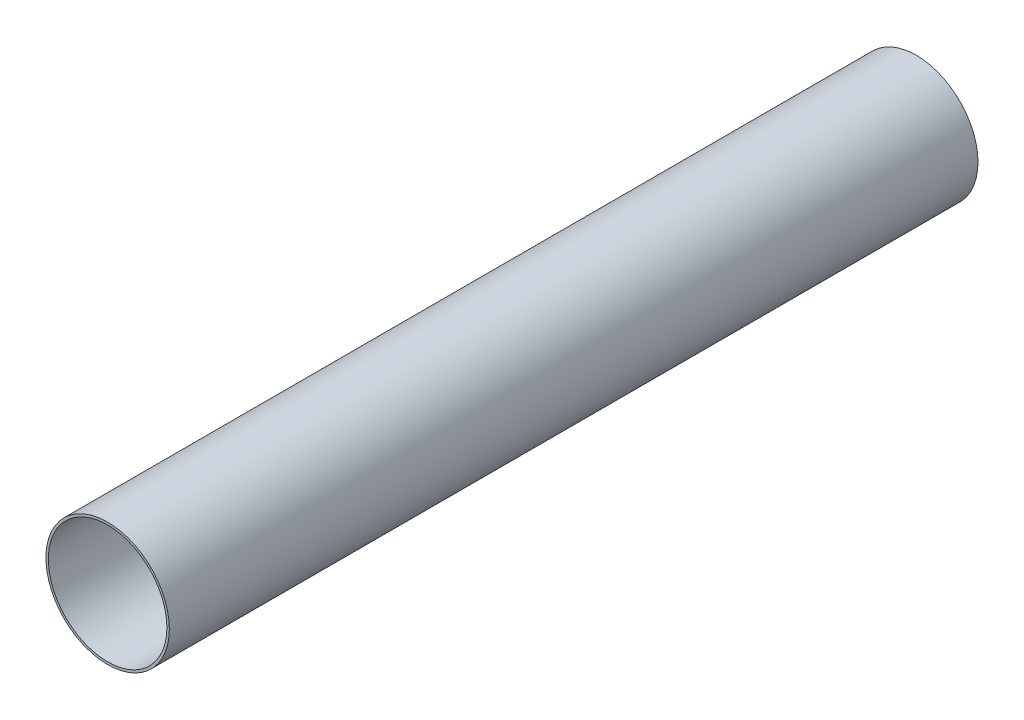
ISO-10303-21;
HEADER;
FILE_DESCRIPTION(('STEP AP214'),'2;1');
FILE_NAME('part.step','',(''),(''),'','','');
FILE_SCHEMA(('AUTOMOTIVE_DESIGN { 1 0 10303 214 1 1 1 1 }'));
ENDSEC;
DATA;
#1=APPLICATION_CONTEXT('core data for automotive mechanical design processes');
#2=APPLICATION_PROTOCOL_DEFINITION('international standard','automotive_design',2000,#1);
#3=PRODUCT_CONTEXT('',#1,'mechanical');
#4=PRODUCT('Part','Part','',(#3));
#5=PRODUCT_RELATED_PRODUCT_CATEGORY('part','',(#4));
#6=PRODUCT_DEFINITION_FORMATION('','',#4);
#7=PRODUCT_DEFINITION_CONTEXT('part definition',#1,'design');
#8=PRODUCT_DEFINITION('design','',#6,#7);
#9=PRODUCT_DEFINITION_SHAPE('','',#8);
#10=(LENGTH_UNIT() NAMED_UNIT(*) SI_UNIT(.MILLI.,.METRE.));
#11=(NAMED_UNIT(*) PLANE_ANGLE_UNIT() SI_UNIT($,.RADIAN.));
#12=(NAMED_UNIT(*) SI_UNIT($,.STERADIAN.) SOLID_ANGLE_UNIT());
#13=UNCERTAINTY_MEASURE_WITH_UNIT(LENGTH_MEASURE(1.E-05),#10,'distance_accuracy_value','');
#14=(GEOMETRIC_REPRESENTATION_CONTEXT(3) GLOBAL_UNCERTAINTY_ASSIGNED_CONTEXT((#13)) GLOBAL_UNIT_ASSIGNED_CONTEXT((#10,
#11,#12)) REPRESENTATION_CONTEXT('',''));
#15=CARTESIAN_POINT('',(0.,0.,0.));
#16=DIRECTION('',(0.,0.,1.));
#17=DIRECTION('',(1.,0.,0.));
#18=AXIS2_PLACEMENT_3D('',#15,#16,#17);
#19=CARTESIAN_POINT('',(0.,0.,150.));
#20=DIRECTION('',(0.,0.,1.));
#21=DIRECTION('',(1.,0.,0.));
#22=AXIS2_PLACEMENT_3D('',#19,#20,#21);
#23=PLANE('',#22);
#24=CARTESIAN_POINT('',(0.,0.,150.));
#25=DIRECTION('',(0.,0.,1.));
#26=DIRECTION('',(1.,0.,0.));
#27=AXIS2_PLACEMENT_3D('',#24,#25,#26);
#28=CIRCLE('',#27,11.45);
#29=CARTESIAN_POINT('',(11.45,0.,150.));
#30=VERTEX_POINT('',#29);
#31=EDGE_CURVE('E10',#30,#30,#28,.T.);
#32=ORIENTED_EDGE('',*,*,#31,.T.);
#33=EDGE_LOOP('',(#32));
#34=FACE_BOUND('',#33,.T.);
#35=CARTESIAN_POINT('',(0.,0.,150.));
#36=DIRECTION('',(0.,0.,1.));
#37=DIRECTION('',(1.,0.,0.));
#38=AXIS2_PLACEMENT_3D('',#35,#36,#37);
#39=CIRCLE('',#38,11.);
#40=CARTESIAN_POINT('',(11.,0.,150.));
#41=VERTEX_POINT('',#40);
#42=EDGE_CURVE('E50',#41,#41,#39,.T.);
#43=ORIENTED_EDGE('',*,*,#42,.F.);
#44=EDGE_LOOP('',(#43));
#45=FACE_BOUND('',#44,.T.);
#46=ADVANCED_FACE('F37',(#34,#45),#23,.T.);
#47=CARTESIAN_POINT('',(0.,0.,0.));
#48=DIRECTION('',(0.,0.,1.));
#49=DIRECTION('',(1.,0.,0.));
#50=AXIS2_PLACEMENT_3D('',#47,#48,#49);
#51=PLANE('',#50);
#52=CARTESIAN_POINT('',(0.,0.,0.));
#53=DIRECTION('',(0.,0.,1.));
#54=DIRECTION('',(1.,0.,0.));
#55=AXIS2_PLACEMENT_3D('',#52,#53,#54);
#56=CIRCLE('',#55,11.45);
#57=CARTESIAN_POINT('',(11.45,0.,0.));
#58=VERTEX_POINT('',#57);
#59=EDGE_CURVE('E41',#58,#58,#56,.T.);
#60=ORIENTED_EDGE('',*,*,#59,.F.);
#61=EDGE_LOOP('',(#60));
#62=FACE_BOUND('',#61,.T.);
#63=CARTESIAN_POINT('',(0.,0.,0.));
#64=DIRECTION('',(0.,0.,1.));
#65=DIRECTION('',(1.,0.,0.));
#66=AXIS2_PLACEMENT_3D('',#63,#64,#65);
#67=CIRCLE('',#66,11.);
#68=CARTESIAN_POINT('',(11.,0.,0.));
#69=VERTEX_POINT('',#68);
#70=EDGE_CURVE('E52',#69,#69,#67,.T.);
#71=ORIENTED_EDGE('',*,*,#70,.T.);
#72=EDGE_LOOP('',(#71));
#73=FACE_BOUND('',#72,.T.);
#74=ADVANCED_FACE('F64',(#62,#73),#51,.F.);
#75=CARTESIAN_POINT('',(0.,0.,150.));
#76=DIRECTION('',(0.,0.,-1.));
#77=DIRECTION('',(-1.,0.,0.));
#78=AXIS2_PLACEMENT_3D('',#75,#76,#77);
#79=CYLINDRICAL_SURFACE('',#78,11.45);
#80=ORIENTED_EDGE('',*,*,#31,.F.);
#81=EDGE_LOOP('',(#80));
#82=FACE_BOUND('',#81,.T.);
#83=ORIENTED_EDGE('',*,*,#59,.T.);
#84=EDGE_LOOP('',(#83));
#85=FACE_BOUND('',#84,.T.);
#86=ADVANCED_FACE('F39',(#82,#85),#79,.T.);
#87=CARTESIAN_POINT('',(0.,0.,150.));
#88=DIRECTION('',(0.,0.,-1.));
#89=DIRECTION('',(-1.,0.,0.));
#90=AXIS2_PLACEMENT_3D('',#87,#88,#89);
#91=CYLINDRICAL_SURFACE('',#90,11.);
#92=ORIENTED_EDGE('',*,*,#42,.T.);
#93=EDGE_LOOP('',(#92));
#94=FACE_BOUND('',#93,.T.);
#95=ORIENTED_EDGE('',*,*,#70,.F.);
#96=EDGE_LOOP('',(#95));
#97=FACE_BOUND('',#96,.T.);
#98=ADVANCED_FACE('F60',(#94,#97),#91,.F.);
#99=CLOSED_SHELL('',(#46,#74,#86,#98));
#100=MANIFOLD_SOLID_BREP('B2',#99);
#101=ADVANCED_BREP_SHAPE_REPRESENTATION('',(#18,#100),#14);
#102=SHAPE_DEFINITION_REPRESENTATION(#9,#101);
ENDSEC;
END-ISO-10303-21;
